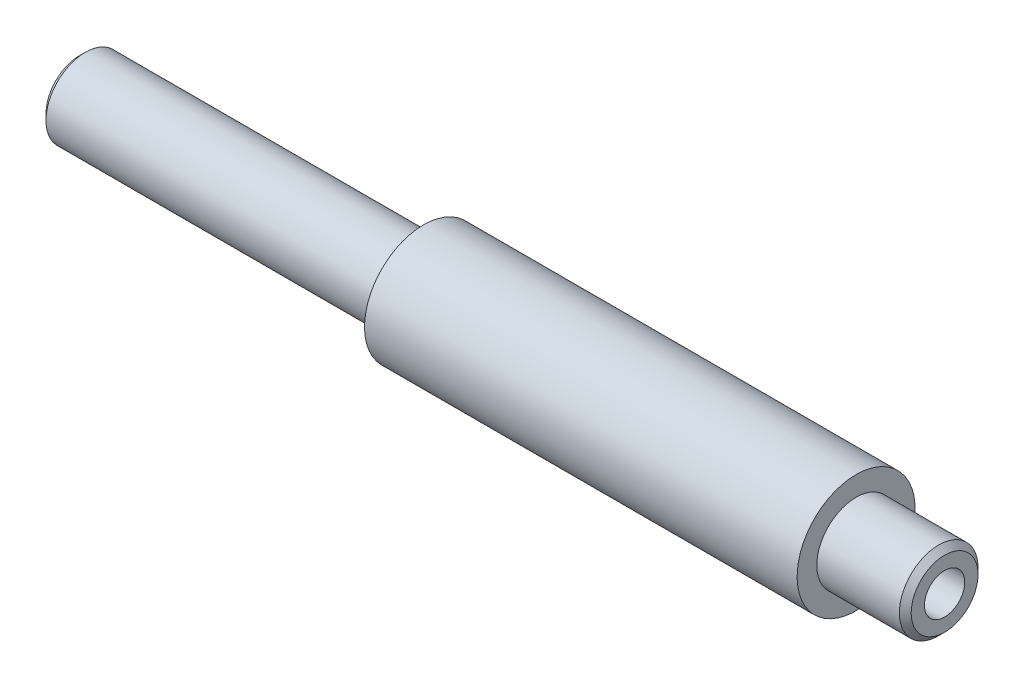
ISO-10303-21;
HEADER;
FILE_DESCRIPTION(('STEP AP214'),'2;1');
FILE_NAME('part.step','',(''),(''),'','','');
FILE_SCHEMA(('AUTOMOTIVE_DESIGN { 1 0 10303 214 1 1 1 1 }'));
ENDSEC;
DATA;
#1=APPLICATION_CONTEXT('core data for automotive mechanical design processes');
#2=APPLICATION_PROTOCOL_DEFINITION('international standard','automotive_design',2000,#1);
#3=PRODUCT_CONTEXT('',#1,'mechanical');
#4=PRODUCT('Part','Part','',(#3));
#5=PRODUCT_RELATED_PRODUCT_CATEGORY('part','',(#4));
#6=PRODUCT_DEFINITION_FORMATION('','',#4);
#7=PRODUCT_DEFINITION_CONTEXT('part definition',#1,'design');
#8=PRODUCT_DEFINITION('design','',#6,#7);
#9=PRODUCT_DEFINITION_SHAPE('','',#8);
#10=(LENGTH_UNIT() NAMED_UNIT(*) SI_UNIT(.MILLI.,.METRE.));
#11=(NAMED_UNIT(*) PLANE_ANGLE_UNIT() SI_UNIT($,.RADIAN.));
#12=(NAMED_UNIT(*) SI_UNIT($,.STERADIAN.) SOLID_ANGLE_UNIT());
#13=UNCERTAINTY_MEASURE_WITH_UNIT(LENGTH_MEASURE(1.E-05),#10,'distance_accuracy_value','');
#14=(GEOMETRIC_REPRESENTATION_CONTEXT(3) GLOBAL_UNCERTAINTY_ASSIGNED_CONTEXT((#13)) GLOBAL_UNIT_ASSIGNED_CONTEXT((#10,
#11,#12)) REPRESENTATION_CONTEXT('',''));
#15=CARTESIAN_POINT('',(0.,0.,0.));
#16=DIRECTION('',(0.,0.,1.));
#17=DIRECTION('',(1.,0.,0.));
#18=AXIS2_PLACEMENT_3D('',#15,#16,#17);
#19=CARTESIAN_POINT('',(0.,0.,0.));
#20=DIRECTION('',(-1.,0.,0.));
#21=DIRECTION('',(0.,-1.,0.));
#22=AXIS2_PLACEMENT_3D('',#19,#20,#21);
#23=PLANE('',#22);
#24=CARTESIAN_POINT('',(0.,0.,0.));
#25=DIRECTION('',(-1.,0.,0.));
#26=DIRECTION('',(0.,-1.,0.));
#27=AXIS2_PLACEMENT_3D('',#24,#25,#26);
#28=CIRCLE('',#27,1.7);
#29=CARTESIAN_POINT('',(0.,-1.7,0.));
#30=VERTEX_POINT('',#29);
#31=EDGE_CURVE('E11',#30,#30,#28,.T.);
#32=ORIENTED_EDGE('',*,*,#31,.T.);
#33=EDGE_LOOP('',(#32));
#34=FACE_BOUND('',#33,.T.);
#35=CARTESIAN_POINT('',(0.,0.,0.));
#36=DIRECTION('',(-1.,0.,0.));
#37=DIRECTION('',(0.,0.,1.));
#38=AXIS2_PLACEMENT_3D('',#35,#36,#37);
#39=CIRCLE('',#38,1.025);
#40=CARTESIAN_POINT('',(0.,0.,1.025));
#41=VERTEX_POINT('',#40);
#42=EDGE_CURVE('E64',#41,#41,#39,.T.);
#43=ORIENTED_EDGE('',*,*,#42,.F.);
#44=EDGE_LOOP('',(#43));
#45=FACE_BOUND('',#44,.T.);
#46=ADVANCED_FACE('F40',(#34,#45),#23,.T.);
#47=CARTESIAN_POINT('',(44.,0.,0.));
#48=DIRECTION('',(1.,0.,0.));
#49=DIRECTION('',(0.,1.,0.));
#50=AXIS2_PLACEMENT_3D('',#47,#48,#49);
#51=CYLINDRICAL_SURFACE('',#50,1.99999999999999);
#52=CARTESIAN_POINT('',(0.299999999999995,0.,0.));
#53=DIRECTION('',(-1.,0.,0.));
#54=DIRECTION('',(0.,-1.,0.));
#55=AXIS2_PLACEMENT_3D('',#52,#53,#54);
#56=CIRCLE('',#55,1.99999999999999);
#57=CARTESIAN_POINT('',(0.299999999999995,-1.99999999999999,0.));
#58=VERTEX_POINT('',#57);
#59=EDGE_CURVE('E48',#58,#58,#56,.F.);
#60=ORIENTED_EDGE('',*,*,#59,.T.);
#61=EDGE_LOOP('',(#60));
#62=FACE_BOUND('',#61,.T.);
#63=CARTESIAN_POINT('',(17.5,0.,0.));
#64=DIRECTION('',(1.,0.,0.));
#65=DIRECTION('',(0.,1.,0.));
#66=AXIS2_PLACEMENT_3D('',#63,#64,#65);
#67=CIRCLE('',#66,1.99999999999999);
#68=CARTESIAN_POINT('',(17.5,2.,0.));
#69=VERTEX_POINT('',#68);
#70=EDGE_CURVE('E84',#69,#69,#67,.T.);
#71=ORIENTED_EDGE('',*,*,#70,.F.);
#72=EDGE_LOOP('',(#71));
#73=FACE_BOUND('',#72,.T.);
#74=ADVANCED_FACE('F95',(#62,#73),#51,.T.);
#75=CARTESIAN_POINT('',(17.5,2.,0.));
#76=DIRECTION('',(-1.,0.,0.));
#77=DIRECTION('',(0.,-1.,0.));
#78=AXIS2_PLACEMENT_3D('',#75,#76,#77);
#79=PLANE('',#78);
#80=ORIENTED_EDGE('',*,*,#70,.T.);
#81=EDGE_LOOP('',(#80));
#82=FACE_BOUND('',#81,.T.);
#83=CARTESIAN_POINT('',(17.5,0.,0.));
#84=DIRECTION('',(1.,0.,0.));
#85=DIRECTION('',(0.,1.,0.));
#86=AXIS2_PLACEMENT_3D('',#83,#84,#85);
#87=CIRCLE('',#86,2.99999999999999);
#88=CARTESIAN_POINT('',(17.5,3.,0.));
#89=VERTEX_POINT('',#88);
#90=EDGE_CURVE('E81',#89,#89,#87,.T.);
#91=ORIENTED_EDGE('',*,*,#90,.F.);
#92=EDGE_LOOP('',(#91));
#93=FACE_BOUND('',#92,.T.);
#94=ADVANCED_FACE('F112',(#82,#93),#79,.T.);
#95=CARTESIAN_POINT('',(44.,0.,0.));
#96=DIRECTION('',(1.,0.,0.));
#97=DIRECTION('',(0.,1.,0.));
#98=AXIS2_PLACEMENT_3D('',#95,#96,#97);
#99=CYLINDRICAL_SURFACE('',#98,2.99999999999999);
#100=ORIENTED_EDGE('',*,*,#90,.T.);
#101=EDGE_LOOP('',(#100));
#102=FACE_BOUND('',#101,.T.);
#103=CARTESIAN_POINT('',(39.5,0.,0.));
#104=DIRECTION('',(1.,0.,0.));
#105=DIRECTION('',(0.,1.,0.));
#106=AXIS2_PLACEMENT_3D('',#103,#104,#105);
#107=CIRCLE('',#106,2.99999999999999);
#108=CARTESIAN_POINT('',(39.5,3.,0.));
#109=VERTEX_POINT('',#108);
#110=EDGE_CURVE('E78',#109,#109,#107,.T.);
#111=ORIENTED_EDGE('',*,*,#110,.F.);
#112=EDGE_LOOP('',(#111));
#113=FACE_BOUND('',#112,.T.);
#114=ADVANCED_FACE('F118',(#102,#113),#99,.T.);
#115=CARTESIAN_POINT('',(39.5,3.,0.));
#116=DIRECTION('',(1.,0.,0.));
#117=DIRECTION('',(0.,1.,0.));
#118=AXIS2_PLACEMENT_3D('',#115,#116,#117);
#119=PLANE('',#118);
#120=ORIENTED_EDGE('',*,*,#110,.T.);
#121=EDGE_LOOP('',(#120));
#122=FACE_BOUND('',#121,.T.);
#123=CARTESIAN_POINT('',(39.5,0.,0.));
#124=DIRECTION('',(1.,0.,0.));
#125=DIRECTION('',(0.,1.,0.));
#126=AXIS2_PLACEMENT_3D('',#123,#124,#125);
#127=CIRCLE('',#126,1.99999999999999);
#128=CARTESIAN_POINT('',(39.5,2.,0.));
#129=VERTEX_POINT('',#128);
#130=EDGE_CURVE('E75',#129,#129,#127,.T.);
#131=ORIENTED_EDGE('',*,*,#130,.F.);
#132=EDGE_LOOP('',(#131));
#133=FACE_BOUND('',#132,.T.);
#134=ADVANCED_FACE('F122',(#122,#133),#119,.T.);
#135=CARTESIAN_POINT('',(44.,0.,0.));
#136=DIRECTION('',(1.,0.,0.));
#137=DIRECTION('',(0.,1.,0.));
#138=AXIS2_PLACEMENT_3D('',#135,#136,#137);
#139=CYLINDRICAL_SURFACE('',#138,1.99999999999999);
#140=CARTESIAN_POINT('',(43.7,0.,0.));
#141=DIRECTION('',(1.,0.,0.));
#142=DIRECTION('',(0.,1.,0.));
#143=AXIS2_PLACEMENT_3D('',#140,#141,#142);
#144=CIRCLE('',#143,1.99999999999999);
#145=CARTESIAN_POINT('',(43.7,2.,0.));
#146=VERTEX_POINT('',#145);
#147=EDGE_CURVE('E90',#146,#146,#144,.F.);
#148=ORIENTED_EDGE('',*,*,#147,.T.);
#149=EDGE_LOOP('',(#148));
#150=FACE_BOUND('',#149,.T.);
#151=ORIENTED_EDGE('',*,*,#130,.T.);
#152=EDGE_LOOP('',(#151));
#153=FACE_BOUND('',#152,.T.);
#154=ADVANCED_FACE('F126',(#150,#153),#139,.T.);
#155=CARTESIAN_POINT('',(44.,2.,0.));
#156=DIRECTION('',(1.,0.,0.));
#157=DIRECTION('',(0.,1.,0.));
#158=AXIS2_PLACEMENT_3D('',#155,#156,#157);
#159=PLANE('',#158);
#160=CARTESIAN_POINT('',(44.,0.,0.));
#161=DIRECTION('',(1.,0.,0.));
#162=DIRECTION('',(0.,1.,0.));
#163=AXIS2_PLACEMENT_3D('',#160,#161,#162);
#164=CIRCLE('',#163,1.69999999999999);
#165=CARTESIAN_POINT('',(44.,1.7,0.));
#166=VERTEX_POINT('',#165);
#167=EDGE_CURVE('E87',#166,#166,#164,.T.);
#168=ORIENTED_EDGE('',*,*,#167,.T.);
#169=EDGE_LOOP('',(#168));
#170=FACE_BOUND('',#169,.T.);
#171=CARTESIAN_POINT('',(44.,0.,0.));
#172=DIRECTION('',(1.,0.,0.));
#173=DIRECTION('',(0.,0.,-1.));
#174=AXIS2_PLACEMENT_3D('',#171,#172,#173);
#175=CIRCLE('',#174,1.025);
#176=CARTESIAN_POINT('',(44.,0.,-1.025));
#177=VERTEX_POINT('',#176);
#178=EDGE_CURVE('E65',#177,#177,#175,.T.);
#179=ORIENTED_EDGE('',*,*,#178,.F.);
#180=EDGE_LOOP('',(#179));
#181=FACE_BOUND('',#180,.T.);
#182=ADVANCED_FACE('F130',(#170,#181),#159,.T.);
#183=CARTESIAN_POINT('',(8.,0.,0.));
#184=DIRECTION('',(-1.,0.,0.));
#185=DIRECTION('',(0.,0.,1.));
#186=AXIS2_PLACEMENT_3D('',#183,#184,#185);
#187=CONICAL_SURFACE('',#186,1.025,1.02974425867665);
#188=CARTESIAN_POINT('',(8.61588213450325,0.,0.));
#189=VERTEX_POINT('',#188);
#190=VERTEX_LOOP('',#189);
#191=FACE_BOUND('',#190,.T.);
#192=CARTESIAN_POINT('',(8.,0.,0.));
#193=DIRECTION('',(-1.,0.,0.));
#194=DIRECTION('',(0.,0.,1.));
#195=AXIS2_PLACEMENT_3D('',#192,#193,#194);
#196=CIRCLE('',#195,1.025);
#197=CARTESIAN_POINT('',(8.,0.,1.025));
#198=VERTEX_POINT('',#197);
#199=EDGE_CURVE('E68',#198,#198,#196,.T.);
#200=ORIENTED_EDGE('',*,*,#199,.T.);
#201=EDGE_LOOP('',(#200));
#202=FACE_BOUND('',#201,.T.);
#203=ADVANCED_FACE('F134',(#191,#202),#187,.F.);
#204=CARTESIAN_POINT('',(0.,0.,0.));
#205=DIRECTION('',(-1.,0.,0.));
#206=DIRECTION('',(0.,0.,1.));
#207=AXIS2_PLACEMENT_3D('',#204,#205,#206);
#208=CYLINDRICAL_SURFACE('',#207,1.025);
#209=ORIENTED_EDGE('',*,*,#199,.F.);
#210=EDGE_LOOP('',(#209));
#211=FACE_BOUND('',#210,.T.);
#212=ORIENTED_EDGE('',*,*,#42,.T.);
#213=EDGE_LOOP('',(#212));
#214=FACE_BOUND('',#213,.T.);
#215=ADVANCED_FACE('F58',(#211,#214),#208,.F.);
#216=CARTESIAN_POINT('',(36.,0.,0.));
#217=DIRECTION('',(1.,0.,0.));
#218=DIRECTION('',(0.,0.,-1.));
#219=AXIS2_PLACEMENT_3D('',#216,#217,#218);
#220=CONICAL_SURFACE('',#219,1.025,1.02974425867665);
#221=CARTESIAN_POINT('',(35.3841178654967,0.,0.));
#222=VERTEX_POINT('',#221);
#223=VERTEX_LOOP('',#222);
#224=FACE_BOUND('',#223,.T.);
#225=CARTESIAN_POINT('',(36.,0.,0.));
#226=DIRECTION('',(1.,0.,0.));
#227=DIRECTION('',(0.,0.,-1.));
#228=AXIS2_PLACEMENT_3D('',#225,#226,#227);
#229=CIRCLE('',#228,1.025);
#230=CARTESIAN_POINT('',(36.,0.,-1.025));
#231=VERTEX_POINT('',#230);
#232=EDGE_CURVE('E62',#231,#231,#229,.T.);
#233=ORIENTED_EDGE('',*,*,#232,.T.);
#234=EDGE_LOOP('',(#233));
#235=FACE_BOUND('',#234,.T.);
#236=ADVANCED_FACE('F54',(#224,#235),#220,.F.);
#237=CARTESIAN_POINT('',(44.,0.,0.));
#238=DIRECTION('',(1.,0.,0.));
#239=DIRECTION('',(0.,0.,-1.));
#240=AXIS2_PLACEMENT_3D('',#237,#238,#239);
#241=CYLINDRICAL_SURFACE('',#240,1.025);
#242=ORIENTED_EDGE('',*,*,#232,.F.);
#243=EDGE_LOOP('',(#242));
#244=FACE_BOUND('',#243,.T.);
#245=ORIENTED_EDGE('',*,*,#178,.T.);
#246=EDGE_LOOP('',(#245));
#247=FACE_BOUND('',#246,.T.);
#248=ADVANCED_FACE('F57',(#244,#247),#241,.F.);
#249=CARTESIAN_POINT('',(44.,0.,0.));
#250=DIRECTION('',(-1.,0.,0.));
#251=DIRECTION('',(0.,-1.,0.));
#252=AXIS2_PLACEMENT_3D('',#249,#250,#251);
#253=CONICAL_SURFACE('',#252,1.69999999999999,0.785398163397449);
#254=ORIENTED_EDGE('',*,*,#147,.F.);
#255=EDGE_LOOP('',(#254));
#256=FACE_BOUND('',#255,.T.);
#257=ORIENTED_EDGE('',*,*,#167,.F.);
#258=EDGE_LOOP('',(#257));
#259=FACE_BOUND('',#258,.T.);
#260=ADVANCED_FACE('F99',(#256,#259),#253,.T.);
#261=CARTESIAN_POINT('',(0.299999999999995,0.,0.));
#262=DIRECTION('',(1.,0.,0.));
#263=DIRECTION('',(0.,1.,0.));
#264=AXIS2_PLACEMENT_3D('',#261,#262,#263);
#265=CONICAL_SURFACE('',#264,1.99999999999999,0.785398163397446);
#266=ORIENTED_EDGE('',*,*,#31,.F.);
#267=EDGE_LOOP('',(#266));
#268=FACE_BOUND('',#267,.T.);
#269=ORIENTED_EDGE('',*,*,#59,.F.);
#270=EDGE_LOOP('',(#269));
#271=FACE_BOUND('',#270,.T.);
#272=ADVANCED_FACE('F42',(#268,#271),#265,.T.);
#273=CLOSED_SHELL('',(#46,#74,#94,#114,#134,#154,#182,#203,#215,#236,#248,#260,#272));
#274=MANIFOLD_SOLID_BREP('B2',#273);
#275=ADVANCED_BREP_SHAPE_REPRESENTATION('',(#18,#274),#14);
#276=SHAPE_DEFINITION_REPRESENTATION(#9,#275);
ENDSEC;
END-ISO-10303-21;
